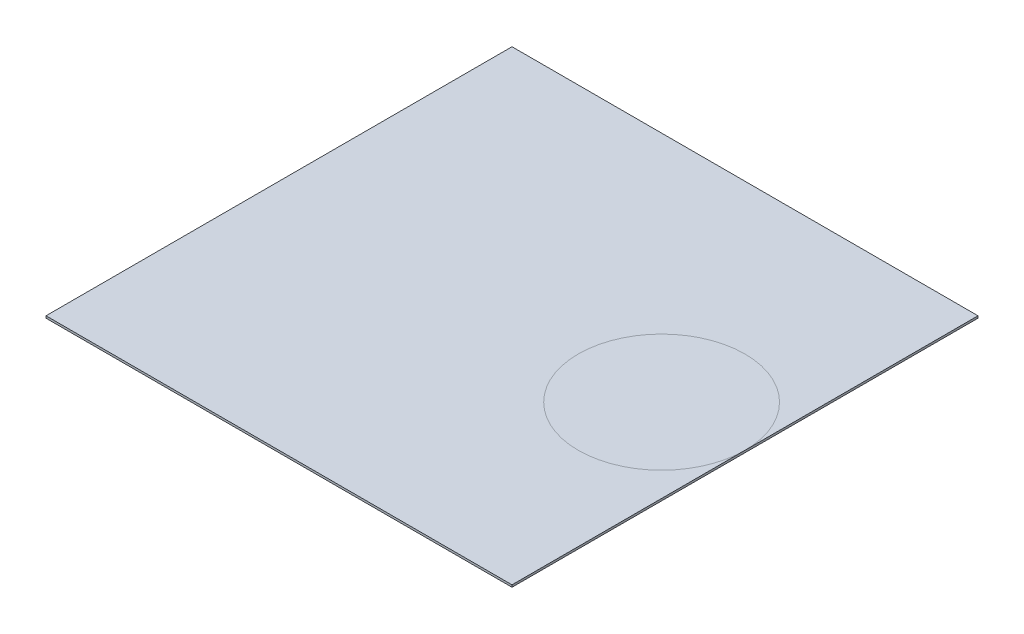
ISO-10303-21;
HEADER;
FILE_DESCRIPTION(('STEP AP214'),'2;1');
FILE_NAME('part.step','',(''),(''),'','','');
FILE_SCHEMA(('AUTOMOTIVE_DESIGN { 1 0 10303 214 1 1 1 1 }'));
ENDSEC;
DATA;
#1=APPLICATION_CONTEXT('core data for automotive mechanical design processes');
#2=APPLICATION_PROTOCOL_DEFINITION('international standard','automotive_design',2000,#1);
#3=PRODUCT_CONTEXT('',#1,'mechanical');
#4=PRODUCT('Part','Part','',(#3));
#5=PRODUCT_RELATED_PRODUCT_CATEGORY('part','',(#4));
#6=PRODUCT_DEFINITION_FORMATION('','',#4);
#7=PRODUCT_DEFINITION_CONTEXT('part definition',#1,'design');
#8=PRODUCT_DEFINITION('design','',#6,#7);
#9=PRODUCT_DEFINITION_SHAPE('','',#8);
#10=(LENGTH_UNIT() NAMED_UNIT(*) SI_UNIT(.MILLI.,.METRE.));
#11=(NAMED_UNIT(*) PLANE_ANGLE_UNIT() SI_UNIT($,.RADIAN.));
#12=(NAMED_UNIT(*) SI_UNIT($,.STERADIAN.) SOLID_ANGLE_UNIT());
#13=UNCERTAINTY_MEASURE_WITH_UNIT(LENGTH_MEASURE(1.E-05),#10,'distance_accuracy_value','');
#14=(GEOMETRIC_REPRESENTATION_CONTEXT(3) GLOBAL_UNCERTAINTY_ASSIGNED_CONTEXT((#13)) GLOBAL_UNIT_ASSIGNED_CONTEXT((#10,
#11,#12)) REPRESENTATION_CONTEXT('',''));
#15=CARTESIAN_POINT('',(0.,0.,0.));
#16=DIRECTION('',(0.,0.,1.));
#17=DIRECTION('',(1.,0.,0.));
#18=AXIS2_PLACEMENT_3D('',#15,#16,#17);
#19=CARTESIAN_POINT('',(0.,0.32,0.));
#20=DIRECTION('',(0.,-1.,0.));
#21=DIRECTION('',(0.,0.,-1.));
#22=AXIS2_PLACEMENT_3D('',#19,#20,#21);
#23=PLANE('',#22);
#24=DIRECTION('',(0.,0.,-1.));
#25=VECTOR('',#24,1.);
#26=CARTESIAN_POINT('',(69.85,0.32,69.85));
#27=LINE('',#26,#25);
#28=CARTESIAN_POINT('',(69.85,0.32,69.85));
#29=VERTEX_POINT('',#28);
#30=CARTESIAN_POINT('',(69.85,0.32,0.));
#31=VERTEX_POINT('',#30);
#32=EDGE_CURVE('E95',#29,#31,#27,.T.);
#33=ORIENTED_EDGE('',*,*,#32,.T.);
#34=CARTESIAN_POINT('',(44.85,0.32,0.));
#35=DIRECTION('',(0.,-1.,0.));
#36=DIRECTION('',(0.,0.,-1.));
#37=AXIS2_PLACEMENT_3D('',#34,#35,#36);
#38=CIRCLE('',#37,25.);
#39=EDGE_CURVE('E11',#31,#31,#38,.F.);
#40=ORIENTED_EDGE('',*,*,#39,.F.);
#41=CARTESIAN_POINT('',(69.85,0.32,-69.85));
#42=VERTEX_POINT('',#41);
#43=EDGE_CURVE('E85',#31,#42,#27,.T.);
#44=ORIENTED_EDGE('',*,*,#43,.T.);
#45=DIRECTION('',(-1.,0.,0.));
#46=VECTOR('',#45,1.);
#47=CARTESIAN_POINT('',(-69.85,0.32,-69.85));
#48=LINE('',#47,#46);
#49=CARTESIAN_POINT('',(-69.85,0.32,-69.85));
#50=VERTEX_POINT('',#49);
#51=EDGE_CURVE('E87',#42,#50,#48,.T.);
#52=ORIENTED_EDGE('',*,*,#51,.T.);
#53=DIRECTION('',(0.,0.,1.));
#54=VECTOR('',#53,1.);
#55=CARTESIAN_POINT('',(-69.85,0.32,69.85));
#56=LINE('',#55,#54);
#57=CARTESIAN_POINT('',(-69.85,0.32,69.85));
#58=VERTEX_POINT('',#57);
#59=EDGE_CURVE('E90',#50,#58,#56,.T.);
#60=ORIENTED_EDGE('',*,*,#59,.T.);
#61=DIRECTION('',(1.,0.,0.));
#62=VECTOR('',#61,1.);
#63=CARTESIAN_POINT('',(-69.85,0.32,69.85));
#64=LINE('',#63,#62);
#65=EDGE_CURVE('E60',#58,#29,#64,.T.);
#66=ORIENTED_EDGE('',*,*,#65,.T.);
#67=EDGE_LOOP('',(#33,#40,#44,#52,#60,#66));
#68=FACE_BOUND('',#67,.T.);
#69=ADVANCED_FACE('F40',(#68),#23,.F.);
#70=CARTESIAN_POINT('',(69.85,0.32,69.85));
#71=DIRECTION('',(-1.,0.,0.));
#72=DIRECTION('',(0.,0.,1.));
#73=AXIS2_PLACEMENT_3D('',#70,#71,#72);
#74=PLANE('',#73);
#75=DIRECTION('',(0.,0.,-1.));
#76=VECTOR('',#75,1.);
#77=CARTESIAN_POINT('',(69.85,-0.32,69.85));
#78=LINE('',#77,#76);
#79=CARTESIAN_POINT('',(69.85,-0.32,69.85));
#80=VERTEX_POINT('',#79);
#81=CARTESIAN_POINT('',(69.85,-0.32,-69.85));
#82=VERTEX_POINT('',#81);
#83=EDGE_CURVE('E111',#80,#82,#78,.T.);
#84=ORIENTED_EDGE('',*,*,#83,.T.);
#85=DIRECTION('',(0.,-1.,0.));
#86=VECTOR('',#85,1.);
#87=CARTESIAN_POINT('',(69.85,0.32,-69.85));
#88=LINE('',#87,#86);
#89=EDGE_CURVE('E49',#42,#82,#88,.T.);
#90=ORIENTED_EDGE('',*,*,#89,.F.);
#91=ORIENTED_EDGE('',*,*,#43,.F.);
#92=ORIENTED_EDGE('',*,*,#32,.F.);
#93=DIRECTION('',(0.,-1.,0.));
#94=VECTOR('',#93,1.);
#95=CARTESIAN_POINT('',(69.85,0.32,69.85));
#96=LINE('',#95,#94);
#97=EDGE_CURVE('E107',#29,#80,#96,.T.);
#98=ORIENTED_EDGE('',*,*,#97,.T.);
#99=EDGE_LOOP('',(#84,#90,#91,#92,#98));
#100=FACE_BOUND('',#99,.T.);
#101=ADVANCED_FACE('F42',(#100),#74,.F.);
#102=CARTESIAN_POINT('',(-69.85,0.32,-69.85));
#103=DIRECTION('',(0.,0.,1.));
#104=DIRECTION('',(1.,0.,0.));
#105=AXIS2_PLACEMENT_3D('',#102,#103,#104);
#106=PLANE('',#105);
#107=DIRECTION('',(-1.,0.,0.));
#108=VECTOR('',#107,1.);
#109=CARTESIAN_POINT('',(-69.85,-0.32,-69.85));
#110=LINE('',#109,#108);
#111=CARTESIAN_POINT('',(-69.85,-0.32,-69.85));
#112=VERTEX_POINT('',#111);
#113=EDGE_CURVE('E100',#82,#112,#110,.T.);
#114=ORIENTED_EDGE('',*,*,#113,.T.);
#115=DIRECTION('',(0.,-1.,0.));
#116=VECTOR('',#115,1.);
#117=CARTESIAN_POINT('',(-69.85,0.32,-69.85));
#118=LINE('',#117,#116);
#119=EDGE_CURVE('E98',#50,#112,#118,.T.);
#120=ORIENTED_EDGE('',*,*,#119,.F.);
#121=ORIENTED_EDGE('',*,*,#51,.F.);
#122=ORIENTED_EDGE('',*,*,#89,.T.);
#123=EDGE_LOOP('',(#114,#120,#121,#122));
#124=FACE_BOUND('',#123,.T.);
#125=ADVANCED_FACE('F99',(#124),#106,.F.);
#126=CARTESIAN_POINT('',(-69.85,0.32,69.85));
#127=DIRECTION('',(1.,0.,0.));
#128=DIRECTION('',(0.,0.,-1.));
#129=AXIS2_PLACEMENT_3D('',#126,#127,#128);
#130=PLANE('',#129);
#131=DIRECTION('',(0.,0.,1.));
#132=VECTOR('',#131,1.);
#133=CARTESIAN_POINT('',(-69.85,-0.32,69.85));
#134=LINE('',#133,#132);
#135=CARTESIAN_POINT('',(-69.85,-0.32,69.85));
#136=VERTEX_POINT('',#135);
#137=EDGE_CURVE('E115',#112,#136,#134,.T.);
#138=ORIENTED_EDGE('',*,*,#137,.T.);
#139=DIRECTION('',(0.,-1.,0.));
#140=VECTOR('',#139,1.);
#141=CARTESIAN_POINT('',(-69.85,0.32,69.85));
#142=LINE('',#141,#140);
#143=EDGE_CURVE('E103',#58,#136,#142,.T.);
#144=ORIENTED_EDGE('',*,*,#143,.F.);
#145=ORIENTED_EDGE('',*,*,#59,.F.);
#146=ORIENTED_EDGE('',*,*,#119,.T.);
#147=EDGE_LOOP('',(#138,#144,#145,#146));
#148=FACE_BOUND('',#147,.T.);
#149=ADVANCED_FACE('F105',(#148),#130,.F.);
#150=CARTESIAN_POINT('',(-69.85,0.32,69.85));
#151=DIRECTION('',(0.,0.,-1.));
#152=DIRECTION('',(-1.,0.,0.));
#153=AXIS2_PLACEMENT_3D('',#150,#151,#152);
#154=PLANE('',#153);
#155=DIRECTION('',(1.,0.,0.));
#156=VECTOR('',#155,1.);
#157=CARTESIAN_POINT('',(-69.85,-0.32,69.85));
#158=LINE('',#157,#156);
#159=EDGE_CURVE('E80',#136,#80,#158,.T.);
#160=ORIENTED_EDGE('',*,*,#159,.T.);
#161=ORIENTED_EDGE('',*,*,#97,.F.);
#162=ORIENTED_EDGE('',*,*,#65,.F.);
#163=ORIENTED_EDGE('',*,*,#143,.T.);
#164=EDGE_LOOP('',(#160,#161,#162,#163));
#165=FACE_BOUND('',#164,.T.);
#166=ADVANCED_FACE('F124',(#165),#154,.F.);
#167=ORIENTED_EDGE('',*,*,#39,.T.);
#168=EDGE_LOOP('',(#167));
#169=FACE_BOUND('',#168,.T.);
#170=ADVANCED_FACE('F126',(#169),#23,.F.);
#171=CARTESIAN_POINT('',(0.,-0.32,0.));
#172=DIRECTION('',(0.,-1.,0.));
#173=DIRECTION('',(0.,0.,-1.));
#174=AXIS2_PLACEMENT_3D('',#171,#172,#173);
#175=PLANE('',#174);
#176=ORIENTED_EDGE('',*,*,#83,.F.);
#177=ORIENTED_EDGE('',*,*,#159,.F.);
#178=ORIENTED_EDGE('',*,*,#137,.F.);
#179=ORIENTED_EDGE('',*,*,#113,.F.);
#180=EDGE_LOOP('',(#176,#177,#178,#179));
#181=FACE_BOUND('',#180,.T.);
#182=ADVANCED_FACE('F123',(#181),#175,.T.);
#183=CLOSED_SHELL('',(#69,#101,#125,#149,#166,#170,#182));
#184=MANIFOLD_SOLID_BREP('B2',#183);
#185=ADVANCED_BREP_SHAPE_REPRESENTATION('',(#18,#184),#14);
#186=SHAPE_DEFINITION_REPRESENTATION(#9,#185);
ENDSEC;
END-ISO-10303-21;
